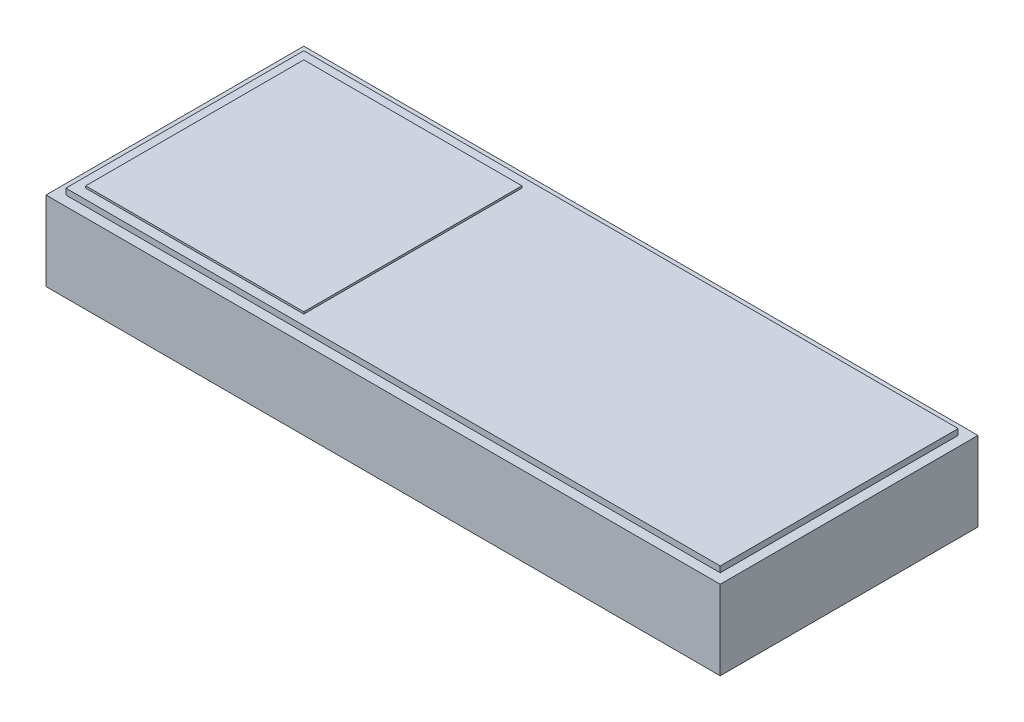
ISO-10303-21;
HEADER;
FILE_DESCRIPTION(('STEP AP214'),'2;1');
FILE_NAME('part.step','',(''),(''),'','','');
FILE_SCHEMA(('AUTOMOTIVE_DESIGN { 1 0 10303 214 1 1 1 1 }'));
ENDSEC;
DATA;
#1=APPLICATION_CONTEXT('core data for automotive mechanical design processes');
#2=APPLICATION_PROTOCOL_DEFINITION('international standard','automotive_design',2000,#1);
#3=PRODUCT_CONTEXT('',#1,'mechanical');
#4=PRODUCT('Part','Part','',(#3));
#5=PRODUCT_RELATED_PRODUCT_CATEGORY('part','',(#4));
#6=PRODUCT_DEFINITION_FORMATION('','',#4);
#7=PRODUCT_DEFINITION_CONTEXT('part definition',#1,'design');
#8=PRODUCT_DEFINITION('design','',#6,#7);
#9=PRODUCT_DEFINITION_SHAPE('','',#8);
#10=(LENGTH_UNIT() NAMED_UNIT(*) SI_UNIT(.MILLI.,.METRE.));
#11=(NAMED_UNIT(*) PLANE_ANGLE_UNIT() SI_UNIT($,.RADIAN.));
#12=(NAMED_UNIT(*) SI_UNIT($,.STERADIAN.) SOLID_ANGLE_UNIT());
#13=UNCERTAINTY_MEASURE_WITH_UNIT(LENGTH_MEASURE(1.E-05),#10,'distance_accuracy_value','');
#14=(GEOMETRIC_REPRESENTATION_CONTEXT(3) GLOBAL_UNCERTAINTY_ASSIGNED_CONTEXT((#13)) GLOBAL_UNIT_ASSIGNED_CONTEXT((#10,
#11,#12)) REPRESENTATION_CONTEXT('',''));
#15=CARTESIAN_POINT('',(0.,0.,0.));
#16=DIRECTION('',(0.,0.,1.));
#17=DIRECTION('',(1.,0.,0.));
#18=AXIS2_PLACEMENT_3D('',#15,#16,#17);
#19=CARTESIAN_POINT('',(0.,0.4,0.));
#20=DIRECTION('',(0.,1.,0.));
#21=DIRECTION('',(1.,0.,0.));
#22=AXIS2_PLACEMENT_3D('',#19,#20,#21);
#23=PLANE('',#22);
#24=DIRECTION('',(0.,0.,-1.));
#25=VECTOR('',#24,1.);
#26=CARTESIAN_POINT('',(1.65,0.4,-0.6));
#27=LINE('',#26,#25);
#28=CARTESIAN_POINT('',(1.65,0.4,0.6));
#29=VERTEX_POINT('',#28);
#30=CARTESIAN_POINT('',(1.65,0.4,-0.6));
#31=VERTEX_POINT('',#30);
#32=EDGE_CURVE('P0_E109',#29,#31,#27,.T.);
#33=ORIENTED_EDGE('',*,*,#32,.F.);
#34=DIRECTION('',(1.,0.,0.));
#35=VECTOR('',#34,1.);
#36=CARTESIAN_POINT('',(-1.65,0.4,0.6));
#37=LINE('',#36,#35);
#38=CARTESIAN_POINT('',(-1.65,0.4,0.6));
#39=VERTEX_POINT('',#38);
#40=EDGE_CURVE('P0_E26',#39,#29,#37,.T.);
#41=ORIENTED_EDGE('',*,*,#40,.F.);
#42=DIRECTION('',(0.,0.,1.));
#43=VECTOR('',#42,1.);
#44=CARTESIAN_POINT('',(-1.65,0.4,-0.6));
#45=LINE('',#44,#43);
#46=CARTESIAN_POINT('',(-1.65,0.4,-0.6));
#47=VERTEX_POINT('',#46);
#48=EDGE_CURVE('P0_E83',#47,#39,#45,.T.);
#49=ORIENTED_EDGE('',*,*,#48,.F.);
#50=DIRECTION('',(-1.,0.,0.));
#51=VECTOR('',#50,1.);
#52=CARTESIAN_POINT('',(-1.65,0.4,-0.6));
#53=LINE('',#52,#51);
#54=EDGE_CURVE('P0_E86',#31,#47,#53,.T.);
#55=ORIENTED_EDGE('',*,*,#54,.F.);
#56=EDGE_LOOP('',(#33,#41,#49,#55));
#57=FACE_BOUND('',#56,.T.);
#58=ADVANCED_FACE('P0_F17',(#57),#23,.F.);
#59=CARTESIAN_POINT('',(0.,0.43,0.));
#60=DIRECTION('',(0.,1.,0.));
#61=DIRECTION('',(1.,0.,0.));
#62=AXIS2_PLACEMENT_3D('',#59,#60,#61);
#63=PLANE('',#62);
#64=DIRECTION('',(0.,0.,-1.));
#65=VECTOR('',#64,1.);
#66=CARTESIAN_POINT('',(1.65,0.43,-0.6));
#67=LINE('',#66,#65);
#68=CARTESIAN_POINT('',(1.65,0.43,0.6));
#69=VERTEX_POINT('',#68);
#70=CARTESIAN_POINT('',(1.65,0.43,-0.6));
#71=VERTEX_POINT('',#70);
#72=EDGE_CURVE('P0_E78',#69,#71,#67,.T.);
#73=ORIENTED_EDGE('',*,*,#72,.T.);
#74=DIRECTION('',(-1.,0.,0.));
#75=VECTOR('',#74,1.);
#76=CARTESIAN_POINT('',(-1.65,0.43,-0.6));
#77=LINE('',#76,#75);
#78=CARTESIAN_POINT('',(-1.65,0.43,-0.6));
#79=VERTEX_POINT('',#78);
#80=EDGE_CURVE('P0_E75',#71,#79,#77,.T.);
#81=ORIENTED_EDGE('',*,*,#80,.T.);
#82=DIRECTION('',(0.,0.,1.));
#83=VECTOR('',#82,1.);
#84=CARTESIAN_POINT('',(-1.65,0.43,-0.6));
#85=LINE('',#84,#83);
#86=CARTESIAN_POINT('',(-1.65,0.43,0.6));
#87=VERTEX_POINT('',#86);
#88=EDGE_CURVE('P0_E63',#79,#87,#85,.T.);
#89=ORIENTED_EDGE('',*,*,#88,.T.);
#90=DIRECTION('',(1.,0.,0.));
#91=VECTOR('',#90,1.);
#92=CARTESIAN_POINT('',(-1.65,0.43,0.6));
#93=LINE('',#92,#91);
#94=EDGE_CURVE('P0_E11',#87,#69,#93,.T.);
#95=ORIENTED_EDGE('',*,*,#94,.T.);
#96=EDGE_LOOP('',(#73,#81,#89,#95));
#97=FACE_BOUND('',#96,.T.);
#98=ADVANCED_FACE('P0_F76',(#97),#63,.T.);
#99=CARTESIAN_POINT('',(-1.65,0.43,0.6));
#100=DIRECTION('',(0.,0.,-1.));
#101=DIRECTION('',(0.,-1.,0.));
#102=AXIS2_PLACEMENT_3D('',#99,#100,#101);
#103=PLANE('',#102);
#104=ORIENTED_EDGE('',*,*,#40,.T.);
#105=DIRECTION('',(0.,-1.,0.));
#106=VECTOR('',#105,1.);
#107=CARTESIAN_POINT('',(1.65,0.43,0.6));
#108=LINE('',#107,#106);
#109=EDGE_CURVE('P0_E93',#69,#29,#108,.T.);
#110=ORIENTED_EDGE('',*,*,#109,.F.);
#111=ORIENTED_EDGE('',*,*,#94,.F.);
#112=DIRECTION('',(0.,-1.,0.));
#113=VECTOR('',#112,1.);
#114=CARTESIAN_POINT('',(-1.65,0.43,0.6));
#115=LINE('',#114,#113);
#116=EDGE_CURVE('P0_E70',#87,#39,#115,.T.);
#117=ORIENTED_EDGE('',*,*,#116,.T.);
#118=EDGE_LOOP('',(#104,#110,#111,#117));
#119=FACE_BOUND('',#118,.T.);
#120=ADVANCED_FACE('P0_F103',(#119),#103,.F.);
#121=CARTESIAN_POINT('',(-1.65,0.43,-0.6));
#122=DIRECTION('',(1.,0.,0.));
#123=DIRECTION('',(0.,0.,-1.));
#124=AXIS2_PLACEMENT_3D('',#121,#122,#123);
#125=PLANE('',#124);
#126=ORIENTED_EDGE('',*,*,#48,.T.);
#127=ORIENTED_EDGE('',*,*,#116,.F.);
#128=ORIENTED_EDGE('',*,*,#88,.F.);
#129=DIRECTION('',(0.,-1.,0.));
#130=VECTOR('',#129,1.);
#131=CARTESIAN_POINT('',(-1.65,0.43,-0.6));
#132=LINE('',#131,#130);
#133=EDGE_CURVE('P0_E68',#79,#47,#132,.T.);
#134=ORIENTED_EDGE('',*,*,#133,.T.);
#135=EDGE_LOOP('',(#126,#127,#128,#134));
#136=FACE_BOUND('',#135,.T.);
#137=ADVANCED_FACE('P0_F66',(#136),#125,.F.);
#138=CARTESIAN_POINT('',(-1.65,0.43,-0.6));
#139=DIRECTION('',(0.,0.,1.));
#140=DIRECTION('',(1.,0.,0.));
#141=AXIS2_PLACEMENT_3D('',#138,#139,#140);
#142=PLANE('',#141);
#143=ORIENTED_EDGE('',*,*,#54,.T.);
#144=ORIENTED_EDGE('',*,*,#133,.F.);
#145=ORIENTED_EDGE('',*,*,#80,.F.);
#146=DIRECTION('',(0.,-1.,0.));
#147=VECTOR('',#146,1.);
#148=CARTESIAN_POINT('',(1.65,0.43,-0.6));
#149=LINE('',#148,#147);
#150=EDGE_CURVE('P0_E112',#71,#31,#149,.T.);
#151=ORIENTED_EDGE('',*,*,#150,.T.);
#152=EDGE_LOOP('',(#143,#144,#145,#151));
#153=FACE_BOUND('',#152,.T.);
#154=ADVANCED_FACE('P0_F85',(#153),#142,.F.);
#155=CARTESIAN_POINT('',(1.65,0.43,-0.6));
#156=DIRECTION('',(-1.,0.,0.));
#157=DIRECTION('',(0.,0.,1.));
#158=AXIS2_PLACEMENT_3D('',#155,#156,#157);
#159=PLANE('',#158);
#160=ORIENTED_EDGE('',*,*,#32,.T.);
#161=ORIENTED_EDGE('',*,*,#150,.F.);
#162=ORIENTED_EDGE('',*,*,#72,.F.);
#163=ORIENTED_EDGE('',*,*,#109,.T.);
#164=EDGE_LOOP('',(#160,#161,#162,#163));
#165=FACE_BOUND('',#164,.T.);
#166=ADVANCED_FACE('P0_F108',(#165),#159,.F.);
#167=CLOSED_SHELL('',(#58,#98,#120,#137,#154,#166));
#168=MANIFOLD_SOLID_BREP('P0_B1',#167);
#169=CARTESIAN_POINT('',(0.,0.,0.));
#170=DIRECTION('',(0.,-1.,0.));
#171=DIRECTION('',(0.,0.,-1.));
#172=AXIS2_PLACEMENT_3D('',#169,#170,#171);
#173=PLANE('',#172);
#174=DIRECTION('',(0.,0.,1.));
#175=VECTOR('',#174,1.);
#176=CARTESIAN_POINT('',(1.65,0.,0.6));
#177=LINE('',#176,#175);
#178=CARTESIAN_POINT('',(1.65,0.,-0.6));
#179=VERTEX_POINT('',#178);
#180=CARTESIAN_POINT('',(1.65,0.,0.6));
#181=VERTEX_POINT('',#180);
#182=EDGE_CURVE('P1_E80',#179,#181,#177,.T.);
#183=ORIENTED_EDGE('',*,*,#182,.F.);
#184=DIRECTION('',(1.,0.,0.));
#185=VECTOR('',#184,1.);
#186=CARTESIAN_POINT('',(-1.65,0.,-0.6));
#187=LINE('',#186,#185);
#188=CARTESIAN_POINT('',(-1.65,0.,-0.6));
#189=VERTEX_POINT('',#188);
#190=EDGE_CURVE('P1_E25',#189,#179,#187,.T.);
#191=ORIENTED_EDGE('',*,*,#190,.F.);
#192=DIRECTION('',(0.,0.,-1.));
#193=VECTOR('',#192,1.);
#194=CARTESIAN_POINT('',(-1.65,0.,0.6));
#195=LINE('',#194,#193);
#196=CARTESIAN_POINT('',(-1.65,0.,0.6));
#197=VERTEX_POINT('',#196);
#198=EDGE_CURVE('P1_E101',#197,#189,#195,.T.);
#199=ORIENTED_EDGE('',*,*,#198,.F.);
#200=DIRECTION('',(-1.,0.,0.));
#201=VECTOR('',#200,1.);
#202=CARTESIAN_POINT('',(-1.65,0.,0.6));
#203=LINE('',#202,#201);
#204=EDGE_CURVE('P1_E84',#181,#197,#203,.T.);
#205=ORIENTED_EDGE('',*,*,#204,.F.);
#206=EDGE_LOOP('',(#183,#191,#199,#205));
#207=FACE_BOUND('',#206,.T.);
#208=ADVANCED_FACE('P1_F17',(#207),#173,.F.);
#209=CARTESIAN_POINT('',(0.,-0.01,0.));
#210=DIRECTION('',(0.,-1.,0.));
#211=DIRECTION('',(0.,0.,-1.));
#212=AXIS2_PLACEMENT_3D('',#209,#210,#211);
#213=PLANE('',#212);
#214=DIRECTION('',(0.,0.,1.));
#215=VECTOR('',#214,1.);
#216=CARTESIAN_POINT('',(1.65,-0.01,0.6));
#217=LINE('',#216,#215);
#218=CARTESIAN_POINT('',(1.65,-0.01,-0.6));
#219=VERTEX_POINT('',#218);
#220=CARTESIAN_POINT('',(1.65,-0.01,0.6));
#221=VERTEX_POINT('',#220);
#222=EDGE_CURVE('P1_E82',#219,#221,#217,.T.);
#223=ORIENTED_EDGE('',*,*,#222,.T.);
#224=DIRECTION('',(-1.,0.,0.));
#225=VECTOR('',#224,1.);
#226=CARTESIAN_POINT('',(-1.65,-0.01,0.6));
#227=LINE('',#226,#225);
#228=CARTESIAN_POINT('',(-1.65,-0.01,0.6));
#229=VERTEX_POINT('',#228);
#230=EDGE_CURVE('P1_E107',#221,#229,#227,.T.);
#231=ORIENTED_EDGE('',*,*,#230,.T.);
#232=DIRECTION('',(0.,0.,-1.));
#233=VECTOR('',#232,1.);
#234=CARTESIAN_POINT('',(-1.65,-0.01,0.6));
#235=LINE('',#234,#233);
#236=CARTESIAN_POINT('',(-1.65,-0.01,-0.6));
#237=VERTEX_POINT('',#236);
#238=EDGE_CURVE('P1_E74',#229,#237,#235,.T.);
#239=ORIENTED_EDGE('',*,*,#238,.T.);
#240=DIRECTION('',(1.,0.,0.));
#241=VECTOR('',#240,1.);
#242=CARTESIAN_POINT('',(-1.65,-0.01,-0.6));
#243=LINE('',#242,#241);
#244=EDGE_CURVE('P1_E11',#237,#219,#243,.T.);
#245=ORIENTED_EDGE('',*,*,#244,.T.);
#246=EDGE_LOOP('',(#223,#231,#239,#245));
#247=FACE_BOUND('',#246,.T.);
#248=ADVANCED_FACE('P1_F122',(#247),#213,.T.);
#249=CARTESIAN_POINT('',(-1.65,-0.01,-0.6));
#250=DIRECTION('',(0.,0.,1.));
#251=DIRECTION('',(1.,0.,0.));
#252=AXIS2_PLACEMENT_3D('',#249,#250,#251);
#253=PLANE('',#252);
#254=ORIENTED_EDGE('',*,*,#190,.T.);
#255=DIRECTION('',(0.,1.,0.));
#256=VECTOR('',#255,1.);
#257=CARTESIAN_POINT('',(1.65,-0.01,-0.6));
#258=LINE('',#257,#256);
#259=EDGE_CURVE('P1_E68',#219,#179,#258,.T.);
#260=ORIENTED_EDGE('',*,*,#259,.F.);
#261=ORIENTED_EDGE('',*,*,#244,.F.);
#262=DIRECTION('',(0.,1.,0.));
#263=VECTOR('',#262,1.);
#264=CARTESIAN_POINT('',(-1.65,-0.01,-0.6));
#265=LINE('',#264,#263);
#266=EDGE_CURVE('P1_E71',#237,#189,#265,.T.);
#267=ORIENTED_EDGE('',*,*,#266,.T.);
#268=EDGE_LOOP('',(#254,#260,#261,#267));
#269=FACE_BOUND('',#268,.T.);
#270=ADVANCED_FACE('P1_F67',(#269),#253,.F.);
#271=CARTESIAN_POINT('',(-1.65,-0.01,0.6));
#272=DIRECTION('',(1.,0.,0.));
#273=DIRECTION('',(0.,0.,1.));
#274=AXIS2_PLACEMENT_3D('',#271,#272,#273);
#275=PLANE('',#274);
#276=ORIENTED_EDGE('',*,*,#198,.T.);
#277=ORIENTED_EDGE('',*,*,#266,.F.);
#278=ORIENTED_EDGE('',*,*,#238,.F.);
#279=DIRECTION('',(0.,1.,0.));
#280=VECTOR('',#279,1.);
#281=CARTESIAN_POINT('',(-1.65,-0.01,0.6));
#282=LINE('',#281,#280);
#283=EDGE_CURVE('P1_E106',#229,#197,#282,.T.);
#284=ORIENTED_EDGE('',*,*,#283,.T.);
#285=EDGE_LOOP('',(#276,#277,#278,#284));
#286=FACE_BOUND('',#285,.T.);
#287=ADVANCED_FACE('P1_F117',(#286),#275,.F.);
#288=CARTESIAN_POINT('',(-1.65,-0.01,0.6));
#289=DIRECTION('',(0.,0.,-1.));
#290=DIRECTION('',(0.,-1.,0.));
#291=AXIS2_PLACEMENT_3D('',#288,#289,#290);
#292=PLANE('',#291);
#293=ORIENTED_EDGE('',*,*,#204,.T.);
#294=ORIENTED_EDGE('',*,*,#283,.F.);
#295=ORIENTED_EDGE('',*,*,#230,.F.);
#296=DIRECTION('',(0.,1.,0.));
#297=VECTOR('',#296,1.);
#298=CARTESIAN_POINT('',(1.65,-0.01,0.6));
#299=LINE('',#298,#297);
#300=EDGE_CURVE('P1_E89',#221,#181,#299,.T.);
#301=ORIENTED_EDGE('',*,*,#300,.T.);
#302=EDGE_LOOP('',(#293,#294,#295,#301));
#303=FACE_BOUND('',#302,.T.);
#304=ADVANCED_FACE('P1_F120',(#303),#292,.F.);
#305=CARTESIAN_POINT('',(1.65,-0.01,0.6));
#306=DIRECTION('',(-1.,0.,0.));
#307=DIRECTION('',(0.,0.,1.));
#308=AXIS2_PLACEMENT_3D('',#305,#306,#307);
#309=PLANE('',#308);
#310=ORIENTED_EDGE('',*,*,#182,.T.);
#311=ORIENTED_EDGE('',*,*,#300,.F.);
#312=ORIENTED_EDGE('',*,*,#222,.F.);
#313=ORIENTED_EDGE('',*,*,#259,.T.);
#314=EDGE_LOOP('',(#310,#311,#312,#313));
#315=FACE_BOUND('',#314,.T.);
#316=ADVANCED_FACE('P1_F78',(#315),#309,.F.);
#317=CLOSED_SHELL('',(#208,#248,#270,#287,#304,#316));
#318=MANIFOLD_SOLID_BREP('P1_B1',#317);
#319=CARTESIAN_POINT('',(0.,0.43,0.));
#320=DIRECTION('',(0.,1.,0.));
#321=DIRECTION('',(1.,0.,0.));
#322=AXIS2_PLACEMENT_3D('',#319,#320,#321);
#323=PLANE('',#322);
#324=DIRECTION('',(0.,0.,-1.));
#325=VECTOR('',#324,1.);
#326=CARTESIAN_POINT('',(-0.5,0.43,-0.55));
#327=LINE('',#326,#325);
#328=CARTESIAN_POINT('',(-0.5,0.43,0.55));
#329=VERTEX_POINT('',#328);
#330=CARTESIAN_POINT('',(-0.5,0.43,-0.55));
#331=VERTEX_POINT('',#330);
#332=EDGE_CURVE('P2_E109',#329,#331,#327,.T.);
#333=ORIENTED_EDGE('',*,*,#332,.F.);
#334=DIRECTION('',(1.,0.,0.));
#335=VECTOR('',#334,1.);
#336=CARTESIAN_POINT('',(-1.6,0.43,0.55));
#337=LINE('',#336,#335);
#338=CARTESIAN_POINT('',(-1.6,0.43,0.55));
#339=VERTEX_POINT('',#338);
#340=EDGE_CURVE('P2_E26',#339,#329,#337,.T.);
#341=ORIENTED_EDGE('',*,*,#340,.F.);
#342=DIRECTION('',(0.,0.,1.));
#343=VECTOR('',#342,1.);
#344=CARTESIAN_POINT('',(-1.6,0.43,-0.55));
#345=LINE('',#344,#343);
#346=CARTESIAN_POINT('',(-1.6,0.43,-0.55));
#347=VERTEX_POINT('',#346);
#348=EDGE_CURVE('P2_E80',#347,#339,#345,.T.);
#349=ORIENTED_EDGE('',*,*,#348,.F.);
#350=DIRECTION('',(-1.,0.,0.));
#351=VECTOR('',#350,1.);
#352=CARTESIAN_POINT('',(-1.6,0.43,-0.55));
#353=LINE('',#352,#351);
#354=EDGE_CURVE('P2_E84',#331,#347,#353,.T.);
#355=ORIENTED_EDGE('',*,*,#354,.F.);
#356=EDGE_LOOP('',(#333,#341,#349,#355));
#357=FACE_BOUND('',#356,.T.);
#358=ADVANCED_FACE('P2_F17',(#357),#323,.F.);
#359=CARTESIAN_POINT('',(0.,0.44,0.));
#360=DIRECTION('',(0.,1.,0.));
#361=DIRECTION('',(1.,0.,0.));
#362=AXIS2_PLACEMENT_3D('',#359,#360,#361);
#363=PLANE('',#362);
#364=DIRECTION('',(0.,0.,-1.));
#365=VECTOR('',#364,1.);
#366=CARTESIAN_POINT('',(-0.5,0.44,-0.55));
#367=LINE('',#366,#365);
#368=CARTESIAN_POINT('',(-0.5,0.44,0.55));
#369=VERTEX_POINT('',#368);
#370=CARTESIAN_POINT('',(-0.5,0.44,-0.55));
#371=VERTEX_POINT('',#370);
#372=EDGE_CURVE('P2_E75',#369,#371,#367,.T.);
#373=ORIENTED_EDGE('',*,*,#372,.T.);
#374=DIRECTION('',(-1.,0.,0.));
#375=VECTOR('',#374,1.);
#376=CARTESIAN_POINT('',(-1.6,0.44,-0.55));
#377=LINE('',#376,#375);
#378=CARTESIAN_POINT('',(-1.6,0.44,-0.55));
#379=VERTEX_POINT('',#378);
#380=EDGE_CURVE('P2_E72',#371,#379,#377,.T.);
#381=ORIENTED_EDGE('',*,*,#380,.T.);
#382=DIRECTION('',(0.,0.,1.));
#383=VECTOR('',#382,1.);
#384=CARTESIAN_POINT('',(-1.6,0.44,-0.55));
#385=LINE('',#384,#383);
#386=CARTESIAN_POINT('',(-1.6,0.44,0.55));
#387=VERTEX_POINT('',#386);
#388=EDGE_CURVE('P2_E60',#379,#387,#385,.T.);
#389=ORIENTED_EDGE('',*,*,#388,.T.);
#390=DIRECTION('',(1.,0.,0.));
#391=VECTOR('',#390,1.);
#392=CARTESIAN_POINT('',(-1.6,0.44,0.55));
#393=LINE('',#392,#391);
#394=EDGE_CURVE('P2_E11',#387,#369,#393,.T.);
#395=ORIENTED_EDGE('',*,*,#394,.T.);
#396=EDGE_LOOP('',(#373,#381,#389,#395));
#397=FACE_BOUND('',#396,.T.);
#398=ADVANCED_FACE('P2_F73',(#397),#363,.T.);
#399=CARTESIAN_POINT('',(-1.6,0.44,0.55));
#400=DIRECTION('',(0.,0.,-1.));
#401=DIRECTION('',(0.,-1.,0.));
#402=AXIS2_PLACEMENT_3D('',#399,#400,#401);
#403=PLANE('',#402);
#404=ORIENTED_EDGE('',*,*,#340,.T.);
#405=DIRECTION('',(0.,-1.,0.));
#406=VECTOR('',#405,1.);
#407=CARTESIAN_POINT('',(-0.5,0.44,0.55));
#408=LINE('',#407,#406);
#409=EDGE_CURVE('P2_E91',#369,#329,#408,.T.);
#410=ORIENTED_EDGE('',*,*,#409,.F.);
#411=ORIENTED_EDGE('',*,*,#394,.F.);
#412=DIRECTION('',(0.,-1.,0.));
#413=VECTOR('',#412,1.);
#414=CARTESIAN_POINT('',(-1.6,0.44,0.55));
#415=LINE('',#414,#413);
#416=EDGE_CURVE('P2_E67',#387,#339,#415,.T.);
#417=ORIENTED_EDGE('',*,*,#416,.T.);
#418=EDGE_LOOP('',(#404,#410,#411,#417));
#419=FACE_BOUND('',#418,.T.);
#420=ADVANCED_FACE('P2_F102',(#419),#403,.F.);
#421=CARTESIAN_POINT('',(-1.6,0.44,-0.55));
#422=DIRECTION('',(1.,0.,0.));
#423=DIRECTION('',(0.,0.,-1.));
#424=AXIS2_PLACEMENT_3D('',#421,#422,#423);
#425=PLANE('',#424);
#426=ORIENTED_EDGE('',*,*,#348,.T.);
#427=ORIENTED_EDGE('',*,*,#416,.F.);
#428=ORIENTED_EDGE('',*,*,#388,.F.);
#429=DIRECTION('',(0.,-1.,0.));
#430=VECTOR('',#429,1.);
#431=CARTESIAN_POINT('',(-1.6,0.44,-0.55));
#432=LINE('',#431,#430);
#433=EDGE_CURVE('P2_E65',#379,#347,#432,.T.);
#434=ORIENTED_EDGE('',*,*,#433,.T.);
#435=EDGE_LOOP('',(#426,#427,#428,#434));
#436=FACE_BOUND('',#435,.T.);
#437=ADVANCED_FACE('P2_F63',(#436),#425,.F.);
#438=CARTESIAN_POINT('',(-1.6,0.44,-0.55));
#439=DIRECTION('',(0.,0.,1.));
#440=DIRECTION('',(1.,0.,0.));
#441=AXIS2_PLACEMENT_3D('',#438,#439,#440);
#442=PLANE('',#441);
#443=ORIENTED_EDGE('',*,*,#354,.T.);
#444=ORIENTED_EDGE('',*,*,#433,.F.);
#445=ORIENTED_EDGE('',*,*,#380,.F.);
#446=DIRECTION('',(0.,-1.,0.));
#447=VECTOR('',#446,1.);
#448=CARTESIAN_POINT('',(-0.5,0.44,-0.55));
#449=LINE('',#448,#447);
#450=EDGE_CURVE('P2_E113',#371,#331,#449,.T.);
#451=ORIENTED_EDGE('',*,*,#450,.T.);
#452=EDGE_LOOP('',(#443,#444,#445,#451));
#453=FACE_BOUND('',#452,.T.);
#454=ADVANCED_FACE('P2_F82',(#453),#442,.F.);
#455=CARTESIAN_POINT('',(-0.5,0.44,-0.55));
#456=DIRECTION('',(-1.,0.,0.));
#457=DIRECTION('',(0.,0.,1.));
#458=AXIS2_PLACEMENT_3D('',#455,#456,#457);
#459=PLANE('',#458);
#460=ORIENTED_EDGE('',*,*,#332,.T.);
#461=ORIENTED_EDGE('',*,*,#450,.F.);
#462=ORIENTED_EDGE('',*,*,#372,.F.);
#463=ORIENTED_EDGE('',*,*,#409,.T.);
#464=EDGE_LOOP('',(#460,#461,#462,#463));
#465=FACE_BOUND('',#464,.T.);
#466=ADVANCED_FACE('P2_F108',(#465),#459,.F.);
#467=CLOSED_SHELL('',(#358,#398,#420,#437,#454,#466));
#468=MANIFOLD_SOLID_BREP('P2_B1',#467);
#469=CARTESIAN_POINT('',(0.,0.,0.));
#470=DIRECTION('',(0.,1.,0.));
#471=DIRECTION('',(1.,0.,0.));
#472=AXIS2_PLACEMENT_3D('',#469,#470,#471);
#473=PLANE('',#472);
#474=DIRECTION('',(0.,0.,-1.));
#475=VECTOR('',#474,1.);
#476=CARTESIAN_POINT('',(1.7,0.,-0.65));
#477=LINE('',#476,#475);
#478=CARTESIAN_POINT('',(1.7,0.,0.65));
#479=VERTEX_POINT('',#478);
#480=CARTESIAN_POINT('',(1.7,0.,-0.65));
#481=VERTEX_POINT('',#480);
#482=EDGE_CURVE('P3_E94',#479,#481,#477,.T.);
#483=ORIENTED_EDGE('',*,*,#482,.F.);
#484=DIRECTION('',(1.,0.,0.));
#485=VECTOR('',#484,1.);
#486=CARTESIAN_POINT('',(-1.7,0.,0.65));
#487=LINE('',#486,#485);
#488=CARTESIAN_POINT('',(-1.7,0.,0.65));
#489=VERTEX_POINT('',#488);
#490=EDGE_CURVE('P3_E26',#489,#479,#487,.T.);
#491=ORIENTED_EDGE('',*,*,#490,.F.);
#492=DIRECTION('',(0.,0.,1.));
#493=VECTOR('',#492,1.);
#494=CARTESIAN_POINT('',(-1.7,0.,-0.65));
#495=LINE('',#494,#493);
#496=CARTESIAN_POINT('',(-1.7,0.,-0.65));
#497=VERTEX_POINT('',#496);
#498=EDGE_CURVE('P3_E62',#497,#489,#495,.T.);
#499=ORIENTED_EDGE('',*,*,#498,.F.);
#500=DIRECTION('',(-1.,0.,0.));
#501=VECTOR('',#500,1.);
#502=CARTESIAN_POINT('',(-1.7,0.,-0.65));
#503=LINE('',#502,#501);
#504=EDGE_CURVE('P3_E83',#481,#497,#503,.T.);
#505=ORIENTED_EDGE('',*,*,#504,.F.);
#506=EDGE_LOOP('',(#483,#491,#499,#505));
#507=FACE_BOUND('',#506,.T.);
#508=ADVANCED_FACE('P3_F17',(#507),#473,.F.);
#509=CARTESIAN_POINT('',(0.,0.4,0.));
#510=DIRECTION('',(0.,1.,0.));
#511=DIRECTION('',(1.,0.,0.));
#512=AXIS2_PLACEMENT_3D('',#509,#510,#511);
#513=PLANE('',#512);
#514=DIRECTION('',(0.,0.,-1.));
#515=VECTOR('',#514,1.);
#516=CARTESIAN_POINT('',(1.7,0.4,-0.65));
#517=LINE('',#516,#515);
#518=CARTESIAN_POINT('',(1.7,0.4,0.65));
#519=VERTEX_POINT('',#518);
#520=CARTESIAN_POINT('',(1.7,0.4,-0.65));
#521=VERTEX_POINT('',#520);
#522=EDGE_CURVE('P3_E71',#519,#521,#517,.T.);
#523=ORIENTED_EDGE('',*,*,#522,.T.);
#524=DIRECTION('',(-1.,0.,0.));
#525=VECTOR('',#524,1.);
#526=CARTESIAN_POINT('',(-1.7,0.4,-0.65));
#527=LINE('',#526,#525);
#528=CARTESIAN_POINT('',(-1.7,0.4,-0.65));
#529=VERTEX_POINT('',#528);
#530=EDGE_CURVE('P3_E107',#521,#529,#527,.T.);
#531=ORIENTED_EDGE('',*,*,#530,.T.);
#532=DIRECTION('',(0.,0.,1.));
#533=VECTOR('',#532,1.);
#534=CARTESIAN_POINT('',(-1.7,0.4,-0.65));
#535=LINE('',#534,#533);
#536=CARTESIAN_POINT('',(-1.7,0.4,0.65));
#537=VERTEX_POINT('',#536);
#538=EDGE_CURVE('P3_E73',#529,#537,#535,.T.);
#539=ORIENTED_EDGE('',*,*,#538,.T.);
#540=DIRECTION('',(1.,0.,0.));
#541=VECTOR('',#540,1.);
#542=CARTESIAN_POINT('',(-1.7,0.4,0.65));
#543=LINE('',#542,#541);
#544=EDGE_CURVE('P3_E11',#537,#519,#543,.T.);
#545=ORIENTED_EDGE('',*,*,#544,.T.);
#546=EDGE_LOOP('',(#523,#531,#539,#545));
#547=FACE_BOUND('',#546,.T.);
#548=ADVANCED_FACE('P3_F68',(#547),#513,.T.);
#549=CARTESIAN_POINT('',(-1.7,0.4,0.65));
#550=DIRECTION('',(0.,0.,-1.));
#551=DIRECTION('',(0.,-1.,0.));
#552=AXIS2_PLACEMENT_3D('',#549,#550,#551);
#553=PLANE('',#552);
#554=ORIENTED_EDGE('',*,*,#490,.T.);
#555=DIRECTION('',(0.,-1.,0.));
#556=VECTOR('',#555,1.);
#557=CARTESIAN_POINT('',(1.7,0.4,0.65));
#558=LINE('',#557,#556);
#559=EDGE_CURVE('P3_E77',#519,#479,#558,.T.);
#560=ORIENTED_EDGE('',*,*,#559,.F.);
#561=ORIENTED_EDGE('',*,*,#544,.F.);
#562=DIRECTION('',(0.,-1.,0.));
#563=VECTOR('',#562,1.);
#564=CARTESIAN_POINT('',(-1.7,0.4,0.65));
#565=LINE('',#564,#563);
#566=EDGE_CURVE('P3_E102',#537,#489,#565,.T.);
#567=ORIENTED_EDGE('',*,*,#566,.T.);
#568=EDGE_LOOP('',(#554,#560,#561,#567));
#569=FACE_BOUND('',#568,.T.);
#570=ADVANCED_FACE('P3_F78',(#569),#553,.F.);
#571=CARTESIAN_POINT('',(-1.7,0.4,-0.65));
#572=DIRECTION('',(1.,0.,0.));
#573=DIRECTION('',(0.,1.,0.));
#574=AXIS2_PLACEMENT_3D('',#571,#572,#573);
#575=PLANE('',#574);
#576=ORIENTED_EDGE('',*,*,#498,.T.);
#577=ORIENTED_EDGE('',*,*,#566,.F.);
#578=ORIENTED_EDGE('',*,*,#538,.F.);
#579=DIRECTION('',(0.,-1.,0.));
#580=VECTOR('',#579,1.);
#581=CARTESIAN_POINT('',(-1.7,0.4,-0.65));
#582=LINE('',#581,#580);
#583=EDGE_CURVE('P3_E101',#529,#497,#582,.T.);
#584=ORIENTED_EDGE('',*,*,#583,.T.);
#585=EDGE_LOOP('',(#576,#577,#578,#584));
#586=FACE_BOUND('',#585,.T.);
#587=ADVANCED_FACE('P3_F165',(#586),#575,.F.);
#588=CARTESIAN_POINT('',(-1.7,0.4,-0.65));
#589=DIRECTION('',(0.,0.,1.));
#590=DIRECTION('',(1.,0.,0.));
#591=AXIS2_PLACEMENT_3D('',#588,#589,#590);
#592=PLANE('',#591);
#593=ORIENTED_EDGE('',*,*,#504,.T.);
#594=ORIENTED_EDGE('',*,*,#583,.F.);
#595=ORIENTED_EDGE('',*,*,#530,.F.);
#596=DIRECTION('',(0.,-1.,0.));
#597=VECTOR('',#596,1.);
#598=CARTESIAN_POINT('',(1.7,0.4,-0.65));
#599=LINE('',#598,#597);
#600=EDGE_CURVE('P3_E87',#521,#481,#599,.T.);
#601=ORIENTED_EDGE('',*,*,#600,.T.);
#602=EDGE_LOOP('',(#593,#594,#595,#601));
#603=FACE_BOUND('',#602,.T.);
#604=ADVANCED_FACE('P3_F172',(#603),#592,.F.);
#605=CARTESIAN_POINT('',(1.7,0.4,-0.65));
#606=DIRECTION('',(-1.,0.,0.));
#607=DIRECTION('',(0.,1.,0.));
#608=AXIS2_PLACEMENT_3D('',#605,#606,#607);
#609=PLANE('',#608);
#610=ORIENTED_EDGE('',*,*,#482,.T.);
#611=ORIENTED_EDGE('',*,*,#600,.F.);
#612=ORIENTED_EDGE('',*,*,#522,.F.);
#613=ORIENTED_EDGE('',*,*,#559,.T.);
#614=EDGE_LOOP('',(#610,#611,#612,#613));
#615=FACE_BOUND('',#614,.T.);
#616=ADVANCED_FACE('P3_F85',(#615),#609,.F.);
#617=CLOSED_SHELL('',(#508,#548,#570,#587,#604,#616));
#618=MANIFOLD_SOLID_BREP('P3_B1',#617);
#619=ADVANCED_BREP_SHAPE_REPRESENTATION('',(#18,#168,#318,#468,#618),#14);
#620=SHAPE_DEFINITION_REPRESENTATION(#9,#619);
ENDSEC;
END-ISO-10303-21;
